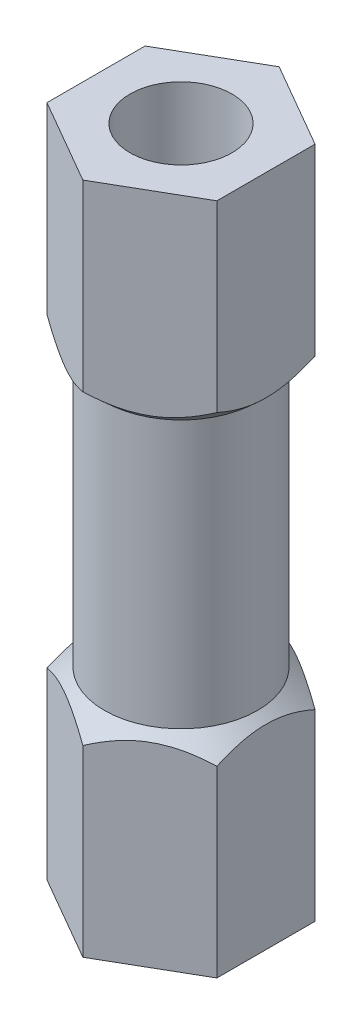
ISO-10303-21;
HEADER;
FILE_DESCRIPTION(('STEP AP214'),'2;1');
FILE_NAME('part.step','',(''),(''),'','','');
FILE_SCHEMA(('AUTOMOTIVE_DESIGN { 1 0 10303 214 1 1 1 1 }'));
ENDSEC;
DATA;
#1=APPLICATION_CONTEXT('core data for automotive mechanical design processes');
#2=APPLICATION_PROTOCOL_DEFINITION('international standard','automotive_design',2000,#1);
#3=PRODUCT_CONTEXT('',#1,'mechanical');
#4=PRODUCT('Part','Part','',(#3));
#5=PRODUCT_RELATED_PRODUCT_CATEGORY('part','',(#4));
#6=PRODUCT_DEFINITION_FORMATION('','',#4);
#7=PRODUCT_DEFINITION_CONTEXT('part definition',#1,'design');
#8=PRODUCT_DEFINITION('design','',#6,#7);
#9=PRODUCT_DEFINITION_SHAPE('','',#8);
#10=(LENGTH_UNIT() NAMED_UNIT(*) SI_UNIT(.MILLI.,.METRE.));
#11=(NAMED_UNIT(*) PLANE_ANGLE_UNIT() SI_UNIT($,.RADIAN.));
#12=(NAMED_UNIT(*) SI_UNIT($,.STERADIAN.) SOLID_ANGLE_UNIT());
#13=UNCERTAINTY_MEASURE_WITH_UNIT(LENGTH_MEASURE(1.E-05),#10,'distance_accuracy_value','');
#14=(GEOMETRIC_REPRESENTATION_CONTEXT(3) GLOBAL_UNCERTAINTY_ASSIGNED_CONTEXT((#13)) GLOBAL_UNIT_ASSIGNED_CONTEXT((#10,
#11,#12)) REPRESENTATION_CONTEXT('',''));
#15=CARTESIAN_POINT('',(0.,0.,0.));
#16=DIRECTION('',(0.,0.,1.));
#17=DIRECTION('',(1.,0.,0.));
#18=AXIS2_PLACEMENT_3D('',#15,#16,#17);
#19=CARTESIAN_POINT('',(-1.541905877699,-13.2460304718258,70.989850960619));
#20=DIRECTION('',(0.,1.,0.));
#21=DIRECTION('',(0.,0.,1.));
#22=AXIS2_PLACEMENT_3D('',#19,#20,#21);
#23=CYLINDRICAL_SURFACE('',#22,1.5);
#24=CARTESIAN_POINT('',(-1.541905877699,-13.2460304718258,70.989850960619));
#25=DIRECTION('',(0.,1.,0.));
#26=DIRECTION('',(0.,0.,1.));
#27=AXIS2_PLACEMENT_3D('',#24,#25,#26);
#28=CIRCLE('',#27,1.5);
#29=CARTESIAN_POINT('',(-0.0419058776989999,-13.2460304718258,70.989850960619));
#30=VERTEX_POINT('',#29);
#31=CARTESIAN_POINT('',(-3.041905877699,-13.2460304718258,70.989850960619));
#32=VERTEX_POINT('',#31);
#33=EDGE_CURVE('E57',#30,#32,#28,.T.);
#34=ORIENTED_EDGE('',*,*,#33,.F.);
#35=CARTESIAN_POINT('',(-1.541905877699,-13.2460304718258,70.989850960619));
#36=DIRECTION('',(0.,1.,0.));
#37=DIRECTION('',(0.,0.,1.));
#38=AXIS2_PLACEMENT_3D('',#35,#36,#37);
#39=CIRCLE('',#38,1.5);
#40=EDGE_CURVE('E519',#32,#30,#39,.T.);
#41=ORIENTED_EDGE('',*,*,#40,.F.);
#42=DIRECTION('',(0.,1.,0.));
#43=VECTOR('',#42,1.);
#44=CARTESIAN_POINT('',(-3.041905877699,-13.2460304718258,70.989850960619));
#45=LINE('',#44,#43);
#46=CARTESIAN_POINT('',(-3.041905877699,6.55396952817417,70.989850960619));
#47=VERTEX_POINT('',#46);
#48=EDGE_CURVE('E11',#32,#47,#45,.T.);
#49=ORIENTED_EDGE('',*,*,#48,.T.);
#50=CARTESIAN_POINT('',(-1.541905877699,6.55396952817417,70.989850960619));
#51=DIRECTION('',(0.,-1.,0.));
#52=DIRECTION('',(0.,0.,-1.));
#53=AXIS2_PLACEMENT_3D('',#50,#51,#52);
#54=CIRCLE('',#53,1.5);
#55=EDGE_CURVE('E353',#47,#47,#54,.T.);
#56=ORIENTED_EDGE('',*,*,#55,.F.);
#57=ORIENTED_EDGE('',*,*,#48,.F.);
#58=EDGE_LOOP('',(#34,#41,#49,#56,#57));
#59=FACE_BOUND('',#58,.T.);
#60=ADVANCED_FACE('F38',(#59),#23,.F.);
#61=CARTESIAN_POINT('',(-1.541905877699,-7.84603047182913,70.989850960619));
#62=DIRECTION('',(0.,-1.,0.));
#63=DIRECTION('',(0.,0.,-1.));
#64=AXIS2_PLACEMENT_3D('',#61,#62,#63);
#65=CONICAL_SURFACE('',#64,2.88000000000367,0.83798122500839);
#66=CARTESIAN_POINT('',(-4.03017079281847,-7.84603047182912,69.5397000332302));
#67=CARTESIAN_POINT('',(-2.791905877699,-7.20715547182333,68.8247874511579));
#68=CARTESIAN_POINT('',(-1.55364096257953,-7.84603047182912,68.1098748690856));
#69=(BOUNDED_CURVE() B_SPLINE_CURVE(2,(#66,#67,#68),.UNSPECIFIED.,.F.,
.F.) B_SPLINE_CURVE_WITH_KNOTS((3,3),(-0.565560291542068,-0.171439030031569),
.UNSPECIFIED.) CURVE() GEOMETRIC_REPRESENTATION_ITEM() RATIONAL_B_SPLINE_CURVE((1.23420074349358,
1.42179925650642,1.23420074349358)) REPRESENTATION_ITEM(''));
#70=CARTESIAN_POINT('',(-4.03017079281208,-7.84603047182583,69.5397000332265));
#71=VERTEX_POINT('',#70);
#72=CARTESIAN_POINT('',(-1.55364096258592,-7.84603047182583,68.1098748690893));
#73=VERTEX_POINT('',#72);
#74=EDGE_CURVE('E336',#71,#73,#69,.T.);
#75=ORIENTED_EDGE('',*,*,#74,.F.);
#76=CARTESIAN_POINT('',(-1.54190587710507,-7.84603047151238,70.9898509609617));
#77=DIRECTION('',(-9.42539925234577E-11,1.,-5.44175679556093E-11));
#78=DIRECTION('',(-1.,-9.42539925234577E-11,0.));
#79=AXIS2_PLACEMENT_3D('',#76,#77,#78);
#80=CIRCLE('',#79,2.88000000068572);
#81=CARTESIAN_POINT('',(-4.041905877699,-7.84603047182583,69.5600257964818));
#82=VERTEX_POINT('',#81);
#83=EDGE_CURVE('E48',#71,#82,#80,.T.);
#84=ORIENTED_EDGE('',*,*,#83,.T.);
#85=CARTESIAN_POINT('',(-4.041905877699,-7.50403047182583,70.989850960619));
#86=CARTESIAN_POINT('',(-4.041905877699,-7.50403047182583,70.3254340627827));
#87=CARTESIAN_POINT('',(-4.04190587769899,-7.84603047182912,69.5600257964744));
#88=(BOUNDED_CURVE() B_SPLINE_CURVE(2,(#85,#86,#87),.UNSPECIFIED.,.F.,
.F.) B_SPLINE_CURVE_WITH_KNOTS((3,3),(-0.368499660786819,-0.171439030031569),
.UNSPECIFIED.) CURVE() GEOMETRIC_REPRESENTATION_ITEM() RATIONAL_B_SPLINE_CURVE((1.328,1.328,1.23420074349358)) REPRESENTATION_ITEM(''));
#89=CARTESIAN_POINT('',(-4.041905877699,-7.50403047182583,70.989850960619));
#90=VERTEX_POINT('',#89);
#91=EDGE_CURVE('E348',#90,#82,#88,.T.);
#92=ORIENTED_EDGE('',*,*,#91,.F.);
#93=DIRECTION('',(0.743294146247167,0.668964731622449,0.));
#94=VECTOR('',#93,1.);
#95=CARTESIAN_POINT('',(-4.106905877699,-7.56253047182583,70.989850960619));
#96=LINE('',#95,#94);
#97=CARTESIAN_POINT('',(-3.791905877699,-7.27903047182583,70.989850960619));
#98=VERTEX_POINT('',#97);
#99=EDGE_CURVE('E400',#90,#98,#96,.T.);
#100=ORIENTED_EDGE('',*,*,#99,.T.);
#101=CARTESIAN_POINT('',(-1.541905877699,-7.27903047182583,70.989850960619));
#102=DIRECTION('',(0.,-1.,0.));
#103=DIRECTION('',(0.,0.,-1.));
#104=AXIS2_PLACEMENT_3D('',#101,#102,#103);
#105=CIRCLE('',#104,2.25);
#106=CARTESIAN_POINT('',(0.708094122301,-7.27903047182583,70.989850960619));
#107=VERTEX_POINT('',#106);
#108=EDGE_CURVE('E406',#98,#107,#105,.T.);
#109=ORIENTED_EDGE('',*,*,#108,.T.);
#110=CARTESIAN_POINT('',(-1.541905877699,-7.27903047182583,70.989850960619));
#111=DIRECTION('',(0.,-1.,0.));
#112=DIRECTION('',(0.,0.,-1.));
#113=AXIS2_PLACEMENT_3D('',#110,#111,#112);
#114=CIRCLE('',#113,2.25);
#115=EDGE_CURVE('E395',#107,#98,#114,.T.);
#116=ORIENTED_EDGE('',*,*,#115,.T.);
#117=ORIENTED_EDGE('',*,*,#99,.F.);
#118=CARTESIAN_POINT('',(-4.041905877699,-7.84603047182912,72.4196761247636));
#119=CARTESIAN_POINT('',(-4.041905877699,-7.50403047182583,71.6542678584552));
#120=CARTESIAN_POINT('',(-4.041905877699,-7.50403047182583,70.989850960619));
#121=(BOUNDED_CURVE() B_SPLINE_CURVE(2,(#118,#119,#120),.UNSPECIFIED.,.F.,
.F.) B_SPLINE_CURVE_WITH_KNOTS((3,3),(-0.565560291542069,-0.368499660786819),
.UNSPECIFIED.) CURVE() GEOMETRIC_REPRESENTATION_ITEM() RATIONAL_B_SPLINE_CURVE((1.23420074349358,
1.328,1.328)) REPRESENTATION_ITEM(''));
#122=CARTESIAN_POINT('',(-4.041905877699,-7.84603047182583,72.4196761247562));
#123=VERTEX_POINT('',#122);
#124=EDGE_CURVE('E354',#123,#90,#121,.T.);
#125=ORIENTED_EDGE('',*,*,#124,.F.);
#126=CARTESIAN_POINT('',(-1.54190587819246,-7.84603047151238,70.989850960905));
#127=DIRECTION('',(-9.4253992482441E-11,1.,5.44175679318921E-11));
#128=DIRECTION('',(-1.,-9.4253992482441E-11,0.));
#129=AXIS2_PLACEMENT_3D('',#126,#127,#128);
#130=CIRCLE('',#129,2.87999999942966);
#131=CARTESIAN_POINT('',(-4.03017079281208,-7.84603047182583,72.4400018880115));
#132=VERTEX_POINT('',#131);
#133=EDGE_CURVE('E386',#123,#132,#130,.T.);
#134=ORIENTED_EDGE('',*,*,#133,.T.);
#135=CARTESIAN_POINT('',(-1.55364096257953,-7.84603047182912,73.8698270521524));
#136=CARTESIAN_POINT('',(-2.791905877699,-7.20715547182333,73.1549144700801));
#137=CARTESIAN_POINT('',(-4.03017079281847,-7.84603047182912,72.4400018880078));
#138=(BOUNDED_CURVE() B_SPLINE_CURVE(2,(#135,#136,#137),.UNSPECIFIED.,.F.,
.F.) B_SPLINE_CURVE_WITH_KNOTS((3,3),(-0.565560291542068,-0.171439030031569),
.UNSPECIFIED.) CURVE() GEOMETRIC_REPRESENTATION_ITEM() RATIONAL_B_SPLINE_CURVE((1.23420074349358,
1.42179925650642,1.23420074349358)) REPRESENTATION_ITEM(''));
#139=CARTESIAN_POINT('',(-1.55364096258592,-7.84603047182583,73.8698270521487));
#140=VERTEX_POINT('',#139);
#141=EDGE_CURVE('E290',#140,#132,#138,.T.);
#142=ORIENTED_EDGE('',*,*,#141,.F.);
#143=CARTESIAN_POINT('',(-1.541905877699,-7.84603047151238,70.9898509602516));
#144=DIRECTION('',(0.,1.,1.08835135899237E-10));
#145=DIRECTION('',(0.,-1.08835135899237E-10,1.));
#146=AXIS2_PLACEMENT_3D('',#143,#144,#145);
#147=CIRCLE('',#146,2.88000000036742);
#148=CARTESIAN_POINT('',(-1.53017079281208,-7.84603047182583,73.8698270521487));
#149=VERTEX_POINT('',#148);
#150=EDGE_CURVE('E377',#140,#149,#147,.T.);
#151=ORIENTED_EDGE('',*,*,#150,.T.);
#152=CARTESIAN_POINT('',(0.946359037420458,-7.84603047182912,72.4400018880078));
#153=CARTESIAN_POINT('',(-0.291905877698998,-7.20715547182335,73.1549144700801));
#154=CARTESIAN_POINT('',(-1.53017079281847,-7.84603047182912,73.8698270521524));
#155=(BOUNDED_CURVE() B_SPLINE_CURVE(2,(#152,#153,#154),.UNSPECIFIED.,.F.,
.F.) B_SPLINE_CURVE_WITH_KNOTS((3,3),(-0.565560291542066,-0.17143903003157),
.UNSPECIFIED.) CURVE() GEOMETRIC_REPRESENTATION_ITEM() RATIONAL_B_SPLINE_CURVE((1.23420074349358,
1.42179925650641,1.23420074349358)) REPRESENTATION_ITEM(''));
#156=CARTESIAN_POINT('',(0.94635903741408,-7.84603047182583,72.4400018880115));
#157=VERTEX_POINT('',#156);
#158=EDGE_CURVE('E300',#157,#149,#155,.T.);
#159=ORIENTED_EDGE('',*,*,#158,.F.);
#160=CARTESIAN_POINT('',(-1.54190587750475,-7.84603047151238,70.9898509607325));
#161=DIRECTION('',(9.42539924935375E-11,1.,5.44175679382882E-11));
#162=DIRECTION('',(-1.,9.42539924935375E-11,0.));
#163=AXIS2_PLACEMENT_3D('',#160,#161,#162);
#164=CIRCLE('',#163,2.87999999977501);
#165=CARTESIAN_POINT('',(0.958094122301,-7.84603047182583,72.4196761247562));
#166=VERTEX_POINT('',#165);
#167=EDGE_CURVE('E368',#157,#166,#164,.T.);
#168=ORIENTED_EDGE('',*,*,#167,.T.);
#169=CARTESIAN_POINT('',(0.958094122301,-7.84603047182912,69.5600257964744));
#170=CARTESIAN_POINT('',(0.958094122301,-7.20715547182335,70.989850960619));
#171=CARTESIAN_POINT('',(0.958094122301,-7.84603047182912,72.4196761247636));
#172=(BOUNDED_CURVE() B_SPLINE_CURVE(2,(#169,#170,#171),.UNSPECIFIED.,.F.,
.F.) B_SPLINE_CURVE_WITH_KNOTS((3,3),(-0.565560291542066,-0.171439030031571),
.UNSPECIFIED.) CURVE() GEOMETRIC_REPRESENTATION_ITEM() RATIONAL_B_SPLINE_CURVE((1.23420074349358,
1.42179925650641,1.23420074349358)) REPRESENTATION_ITEM(''));
#173=CARTESIAN_POINT('',(0.958094122301,-7.84603047182583,69.5600257964818));
#174=VERTEX_POINT('',#173);
#175=EDGE_CURVE('E314',#174,#166,#172,.T.);
#176=ORIENTED_EDGE('',*,*,#175,.F.);
#177=CARTESIAN_POINT('',(-1.54190587831289,-7.84603047151238,70.9898509609736));
#178=DIRECTION('',(9.42539925241471E-11,1.,-5.44175679560201E-11));
#179=DIRECTION('',(-1.,9.42539925241471E-11,0.));
#180=AXIS2_PLACEMENT_3D('',#177,#178,#179);
#181=CIRCLE('',#180,2.88000000070893);
#182=CARTESIAN_POINT('',(0.94635903741408,-7.84603047182583,69.5397000332265));
#183=VERTEX_POINT('',#182);
#184=EDGE_CURVE('E358',#174,#183,#181,.T.);
#185=ORIENTED_EDGE('',*,*,#184,.T.);
#186=CARTESIAN_POINT('',(-1.53017079281846,-7.84603047182912,68.1098748690856));
#187=CARTESIAN_POINT('',(-0.291905877698998,-7.20715547182335,68.8247874511579));
#188=CARTESIAN_POINT('',(0.946359037420471,-7.84603047182912,69.5397000332302));
#189=(BOUNDED_CURVE() B_SPLINE_CURVE(2,(#186,#187,#188),.UNSPECIFIED.,.F.,
.F.) B_SPLINE_CURVE_WITH_KNOTS((3,3),(-0.565560291542066,-0.17143903003157),
.UNSPECIFIED.) CURVE() GEOMETRIC_REPRESENTATION_ITEM() RATIONAL_B_SPLINE_CURVE((1.23420074349358,
1.42179925650641,1.23420074349358)) REPRESENTATION_ITEM(''));
#190=CARTESIAN_POINT('',(-1.53017079281207,-7.84603047182583,68.1098748690893));
#191=VERTEX_POINT('',#190);
#192=EDGE_CURVE('E326',#191,#183,#189,.T.);
#193=ORIENTED_EDGE('',*,*,#192,.F.);
#194=CARTESIAN_POINT('',(-1.54190587769899,-7.84603047151238,70.9898509622402));
#195=DIRECTION('',(0.,1.,-1.08835135946617E-10));
#196=DIRECTION('',(0.,1.08835135946617E-10,1.));
#197=AXIS2_PLACEMENT_3D('',#194,#195,#196);
#198=CIRCLE('',#197,2.88000000162117);
#199=EDGE_CURVE('E355',#191,#73,#198,.T.);
#200=ORIENTED_EDGE('',*,*,#199,.T.);
#201=EDGE_LOOP('',(#75,#84,#92,#100,#109,#116,#117,#125,#134,#142,#151,#159,#168,#176,#185,#193,#200));
#202=FACE_BOUND('',#201,.T.);
#203=ADVANCED_FACE('F537',(#202),#65,.T.);
#204=CARTESIAN_POINT('',(-1.541905877699,-7.84603047182583,70.989850960619));
#205=DIRECTION('',(0.,-1.,0.));
#206=DIRECTION('',(1.,0.,0.));
#207=AXIS2_PLACEMENT_3D('',#204,#205,#206);
#208=PLANE('',#207);
#209=ORIENTED_EDGE('',*,*,#133,.F.);
#210=DIRECTION('',(0.,0.,-1.));
#211=VECTOR('',#210,1.);
#212=CARTESIAN_POINT('',(-4.041905877699,-7.84603047182583,72.4332266335931));
#213=LINE('',#212,#211);
#214=CARTESIAN_POINT('',(-4.041905877699,-7.84603047182583,72.4332266335931));
#215=VERTEX_POINT('',#214);
#216=EDGE_CURVE('E350',#215,#123,#213,.T.);
#217=ORIENTED_EDGE('',*,*,#216,.F.);
#218=DIRECTION('',(-0.866025403784438,0.,-0.5));
#219=VECTOR('',#218,1.);
#220=CARTESIAN_POINT('',(-1.541905877699,-7.84603047182583,73.8766023065671));
#221=LINE('',#220,#219);
#222=EDGE_CURVE('E341',#132,#215,#221,.T.);
#223=ORIENTED_EDGE('',*,*,#222,.F.);
#224=EDGE_LOOP('',(#209,#217,#223));
#225=FACE_BOUND('',#224,.T.);
#226=ADVANCED_FACE('F542',(#225),#208,.F.);
#227=CARTESIAN_POINT('',(-1.541905877699,-7.84603047182583,70.989850960619));
#228=DIRECTION('',(0.,-1.,0.));
#229=DIRECTION('',(1.,0.,0.));
#230=AXIS2_PLACEMENT_3D('',#227,#228,#229);
#231=PLANE('',#230);
#232=ORIENTED_EDGE('',*,*,#150,.F.);
#233=DIRECTION('',(-0.866025403784438,0.,-0.5));
#234=VECTOR('',#233,1.);
#235=CARTESIAN_POINT('',(-1.541905877699,-7.84603047182583,73.8766023065671));
#236=LINE('',#235,#234);
#237=CARTESIAN_POINT('',(-1.541905877699,-7.84603047182583,73.8766023065671));
#238=VERTEX_POINT('',#237);
#239=EDGE_CURVE('E286',#238,#140,#236,.T.);
#240=ORIENTED_EDGE('',*,*,#239,.F.);
#241=DIRECTION('',(-0.866025403784439,0.,0.5));
#242=VECTOR('',#241,1.);
#243=CARTESIAN_POINT('',(0.958094122301,-7.84603047182583,72.4332266335931));
#244=LINE('',#243,#242);
#245=EDGE_CURVE('E297',#149,#238,#244,.T.);
#246=ORIENTED_EDGE('',*,*,#245,.F.);
#247=EDGE_LOOP('',(#232,#240,#246));
#248=FACE_BOUND('',#247,.T.);
#249=ADVANCED_FACE('F548',(#248),#231,.F.);
#250=CARTESIAN_POINT('',(-1.541905877699,-7.84603047182583,70.989850960619));
#251=DIRECTION('',(0.,-1.,0.));
#252=DIRECTION('',(1.,0.,0.));
#253=AXIS2_PLACEMENT_3D('',#250,#251,#252);
#254=PLANE('',#253);
#255=ORIENTED_EDGE('',*,*,#83,.F.);
#256=DIRECTION('',(0.866025403784439,0.,-0.5));
#257=VECTOR('',#256,1.);
#258=CARTESIAN_POINT('',(-4.041905877699,-7.84603047182583,69.5464752876449));
#259=LINE('',#258,#257);
#260=CARTESIAN_POINT('',(-4.041905877699,-7.84603047182583,69.5464752876449));
#261=VERTEX_POINT('',#260);
#262=EDGE_CURVE('E324',#261,#71,#259,.T.);
#263=ORIENTED_EDGE('',*,*,#262,.F.);
#264=DIRECTION('',(0.,0.,-1.));
#265=VECTOR('',#264,1.);
#266=CARTESIAN_POINT('',(-4.041905877699,-7.84603047182583,72.4332266335931));
#267=LINE('',#266,#265);
#268=EDGE_CURVE('E345',#82,#261,#267,.T.);
#269=ORIENTED_EDGE('',*,*,#268,.F.);
#270=EDGE_LOOP('',(#255,#263,#269));
#271=FACE_BOUND('',#270,.T.);
#272=ADVANCED_FACE('F552',(#271),#254,.F.);
#273=CARTESIAN_POINT('',(-1.541905877699,-7.84603047182583,70.989850960619));
#274=DIRECTION('',(0.,-1.,0.));
#275=DIRECTION('',(1.,0.,0.));
#276=AXIS2_PLACEMENT_3D('',#273,#274,#275);
#277=PLANE('',#276);
#278=ORIENTED_EDGE('',*,*,#167,.F.);
#279=DIRECTION('',(-0.866025403784439,0.,0.5));
#280=VECTOR('',#279,1.);
#281=CARTESIAN_POINT('',(0.958094122301,-7.84603047182583,72.4332266335931));
#282=LINE('',#281,#280);
#283=CARTESIAN_POINT('',(0.958094122301,-7.84603047182583,72.4332266335931));
#284=VERTEX_POINT('',#283);
#285=EDGE_CURVE('E301',#284,#157,#282,.T.);
#286=ORIENTED_EDGE('',*,*,#285,.F.);
#287=DIRECTION('',(0.,0.,1.));
#288=VECTOR('',#287,1.);
#289=CARTESIAN_POINT('',(0.958094122301,-7.84603047182583,69.5464752876449));
#290=LINE('',#289,#288);
#291=EDGE_CURVE('E311',#166,#284,#290,.T.);
#292=ORIENTED_EDGE('',*,*,#291,.F.);
#293=EDGE_LOOP('',(#278,#286,#292));
#294=FACE_BOUND('',#293,.T.);
#295=ADVANCED_FACE('F556',(#294),#277,.F.);
#296=CARTESIAN_POINT('',(-1.541905877699,-7.84603047182583,70.989850960619));
#297=DIRECTION('',(0.,-1.,0.));
#298=DIRECTION('',(1.,0.,0.));
#299=AXIS2_PLACEMENT_3D('',#296,#297,#298);
#300=PLANE('',#299);
#301=ORIENTED_EDGE('',*,*,#199,.F.);
#302=DIRECTION('',(0.866025403784439,0.,0.5));
#303=VECTOR('',#302,1.);
#304=CARTESIAN_POINT('',(-1.54190587769899,-7.84603047182583,68.1030996146709));
#305=LINE('',#304,#303);
#306=CARTESIAN_POINT('',(-1.54190587769899,-7.84603047182583,68.1030996146709));
#307=VERTEX_POINT('',#306);
#308=EDGE_CURVE('E312',#307,#191,#305,.T.);
#309=ORIENTED_EDGE('',*,*,#308,.F.);
#310=DIRECTION('',(0.866025403784439,0.,-0.5));
#311=VECTOR('',#310,1.);
#312=CARTESIAN_POINT('',(-4.041905877699,-7.84603047182583,69.5464752876449));
#313=LINE('',#312,#311);
#314=EDGE_CURVE('E334',#73,#307,#313,.T.);
#315=ORIENTED_EDGE('',*,*,#314,.F.);
#316=EDGE_LOOP('',(#301,#309,#315));
#317=FACE_BOUND('',#316,.T.);
#318=ADVANCED_FACE('F560',(#317),#300,.F.);
#319=CARTESIAN_POINT('',(-1.541905877699,-3.34603047182583,70.989850960619));
#320=DIRECTION('',(0.,-1.,0.));
#321=DIRECTION('',(1.,0.,0.));
#322=AXIS2_PLACEMENT_3D('',#319,#320,#321);
#323=CYLINDRICAL_SURFACE('',#322,2.25);
#324=ORIENTED_EDGE('',*,*,#108,.F.);
#325=ORIENTED_EDGE('',*,*,#115,.F.);
#326=DIRECTION('',(0.,1.,0.));
#327=VECTOR('',#326,1.);
#328=CARTESIAN_POINT('',(0.708094122301,-3.34603047182583,70.989850960619));
#329=LINE('',#328,#327);
#330=CARTESIAN_POINT('',(0.708094122301,0.586969528174173,70.989850960619));
#331=VERTEX_POINT('',#330);
#332=EDGE_CURVE('E359',#107,#331,#329,.T.);
#333=ORIENTED_EDGE('',*,*,#332,.T.);
#334=CARTESIAN_POINT('',(-1.541905877699,0.586969528174173,70.989850960619));
#335=DIRECTION('',(0.,1.,0.));
#336=DIRECTION('',(0.,0.,1.));
#337=AXIS2_PLACEMENT_3D('',#334,#335,#336);
#338=CIRCLE('',#337,2.25);
#339=CARTESIAN_POINT('',(-3.791905877699,0.586969528174173,70.989850960619));
#340=VERTEX_POINT('',#339);
#341=EDGE_CURVE('E468',#340,#331,#338,.T.);
#342=ORIENTED_EDGE('',*,*,#341,.F.);
#343=CARTESIAN_POINT('',(-1.541905877699,0.586969528174173,70.989850960619));
#344=DIRECTION('',(0.,1.,0.));
#345=DIRECTION('',(0.,0.,1.));
#346=AXIS2_PLACEMENT_3D('',#343,#344,#345);
#347=CIRCLE('',#346,2.25);
#348=EDGE_CURVE('E466',#331,#340,#347,.T.);
#349=ORIENTED_EDGE('',*,*,#348,.F.);
#350=ORIENTED_EDGE('',*,*,#332,.F.);
#351=EDGE_LOOP('',(#324,#325,#333,#342,#349,#350));
#352=FACE_BOUND('',#351,.T.);
#353=ADVANCED_FACE('F564',(#352),#323,.T.);
#354=CARTESIAN_POINT('',(-1.541905877699,1.15396952817748,70.989850960619));
#355=DIRECTION('',(0.,1.,0.));
#356=DIRECTION('',(0.,0.,1.));
#357=AXIS2_PLACEMENT_3D('',#354,#355,#356);
#358=CONICAL_SURFACE('',#357,2.88000000000367,0.837981225008391);
#359=CARTESIAN_POINT('',(-4.03017079281847,1.15396952817747,72.4400018880078));
#360=CARTESIAN_POINT('',(-2.791905877699,0.515094528171691,73.1549144700801));
#361=CARTESIAN_POINT('',(-1.55364096257953,1.15396952817747,73.8698270521524));
#362=(BOUNDED_CURVE() B_SPLINE_CURVE(2,(#359,#360,#361),.UNSPECIFIED.,.F.,
.F.) B_SPLINE_CURVE_WITH_KNOTS((3,3),(-0.565560291542068,-0.171439030031569),
.UNSPECIFIED.) CURVE() GEOMETRIC_REPRESENTATION_ITEM() RATIONAL_B_SPLINE_CURVE((1.23420074349358,
1.42179925650642,1.23420074349358)) REPRESENTATION_ITEM(''));
#363=CARTESIAN_POINT('',(-4.03017079281208,1.15396952817417,72.4400018880115));
#364=VERTEX_POINT('',#363);
#365=CARTESIAN_POINT('',(-1.55364096258592,1.15396952817417,73.8698270521487));
#366=VERTEX_POINT('',#365);
#367=EDGE_CURVE('E232',#364,#366,#362,.T.);
#368=ORIENTED_EDGE('',*,*,#367,.F.);
#369=CARTESIAN_POINT('',(-1.54190587791684,1.15396952815458,70.9898509607464));
#370=DIRECTION('',(-5.89087453079426E-12,-1.,3.40109799611252E-12));
#371=DIRECTION('',(1.,-5.89087453079426E-12,0.));
#372=AXIS2_PLACEMENT_3D('',#369,#370,#371);
#373=CIRCLE('',#372,2.87999999974765);
#374=CARTESIAN_POINT('',(-4.041905877699,1.15396952817417,72.4196761247562));
#375=VERTEX_POINT('',#374);
#376=EDGE_CURVE('E423',#364,#375,#373,.T.);
#377=ORIENTED_EDGE('',*,*,#376,.T.);
#378=CARTESIAN_POINT('',(-4.041905877699,0.811969528174174,70.989850960619));
#379=CARTESIAN_POINT('',(-4.041905877699,0.811969528174174,71.6542678584552));
#380=CARTESIAN_POINT('',(-4.041905877699,1.15396952817747,72.4196761247636));
#381=(BOUNDED_CURVE() B_SPLINE_CURVE(2,(#378,#379,#380),.UNSPECIFIED.,.F.,
.F.) B_SPLINE_CURVE_WITH_KNOTS((3,3),(-0.368499660786819,-0.171439030031569),
.UNSPECIFIED.) CURVE() GEOMETRIC_REPRESENTATION_ITEM() RATIONAL_B_SPLINE_CURVE((1.328,1.328,1.23420074349358)) REPRESENTATION_ITEM(''));
#382=CARTESIAN_POINT('',(-4.041905877699,0.811969528174174,70.989850960619));
#383=VERTEX_POINT('',#382);
#384=EDGE_CURVE('E488',#383,#375,#381,.T.);
#385=ORIENTED_EDGE('',*,*,#384,.F.);
#386=DIRECTION('',(0.743294146247167,-0.668964731622449,0.));
#387=VECTOR('',#386,1.);
#388=CARTESIAN_POINT('',(-4.106905877699,0.870469528174173,70.989850960619));
#389=LINE('',#388,#387);
#390=EDGE_CURVE('E470',#383,#340,#389,.T.);
#391=ORIENTED_EDGE('',*,*,#390,.T.);
#392=ORIENTED_EDGE('',*,*,#341,.T.);
#393=ORIENTED_EDGE('',*,*,#348,.T.);
#394=ORIENTED_EDGE('',*,*,#390,.F.);
#395=CARTESIAN_POINT('',(-4.04190587769899,1.15396952817747,69.5600257964744));
#396=CARTESIAN_POINT('',(-4.041905877699,0.811969528174174,70.3254340627827));
#397=CARTESIAN_POINT('',(-4.041905877699,0.811969528174174,70.989850960619));
#398=(BOUNDED_CURVE() B_SPLINE_CURVE(2,(#395,#396,#397),.UNSPECIFIED.,.F.,
.F.) B_SPLINE_CURVE_WITH_KNOTS((3,3),(-0.565560291542069,-0.368499660786819),
.UNSPECIFIED.) CURVE() GEOMETRIC_REPRESENTATION_ITEM() RATIONAL_B_SPLINE_CURVE((1.23420074349358,
1.328,1.328)) REPRESENTATION_ITEM(''));
#399=CARTESIAN_POINT('',(-4.041905877699,1.15396952817417,69.5600257964818));
#400=VERTEX_POINT('',#399);
#401=EDGE_CURVE('E492',#400,#383,#398,.T.);
#402=ORIENTED_EDGE('',*,*,#401,.F.);
#403=CARTESIAN_POINT('',(-1.54190587710502,1.15396952815458,70.9898509609617));
#404=DIRECTION('',(-5.8908745327161E-12,-1.,-3.40109799722558E-12));
#405=DIRECTION('',(1.,-5.8908745327161E-12,0.));
#406=AXIS2_PLACEMENT_3D('',#403,#404,#405);
#407=CIRCLE('',#406,2.88000000068577);
#408=CARTESIAN_POINT('',(-4.03017079281208,1.15396952817417,69.5397000332265));
#409=VERTEX_POINT('',#408);
#410=EDGE_CURVE('E457',#400,#409,#407,.T.);
#411=ORIENTED_EDGE('',*,*,#410,.T.);
#412=CARTESIAN_POINT('',(-1.55364096257952,1.15396952817747,68.1098748690856));
#413=CARTESIAN_POINT('',(-2.791905877699,0.515094528171679,68.8247874511579));
#414=CARTESIAN_POINT('',(-4.03017079281847,1.15396952817747,69.5397000332302));
#415=(BOUNDED_CURVE() B_SPLINE_CURVE(2,(#412,#413,#414),.UNSPECIFIED.,.F.,
.F.) B_SPLINE_CURVE_WITH_KNOTS((3,3),(-0.565560291542068,-0.17143903003157),
.UNSPECIFIED.) CURVE() GEOMETRIC_REPRESENTATION_ITEM() RATIONAL_B_SPLINE_CURVE((1.23420074349358,
1.42179925650642,1.23420074349358)) REPRESENTATION_ITEM(''));
#416=CARTESIAN_POINT('',(-1.55364096258592,1.15396952817417,68.1098748690893));
#417=VERTEX_POINT('',#416);
#418=EDGE_CURVE('E278',#417,#409,#415,.T.);
#419=ORIENTED_EDGE('',*,*,#418,.F.);
#420=CARTESIAN_POINT('',(-1.541905877699,1.15396952815458,70.9898509622402));
#421=DIRECTION('',(0.,-1.,-6.80219599666356E-12));
#422=DIRECTION('',(0.,6.80219599666356E-12,-1.));
#423=AXIS2_PLACEMENT_3D('',#420,#421,#422);
#424=CIRCLE('',#423,2.88000000162119);
#425=CARTESIAN_POINT('',(-1.53017079281207,1.15396952817417,68.1098748690893));
#426=VERTEX_POINT('',#425);
#427=EDGE_CURVE('E448',#417,#426,#424,.T.);
#428=ORIENTED_EDGE('',*,*,#427,.T.);
#429=CARTESIAN_POINT('',(0.946359037420471,1.15396952817747,69.5397000332302));
#430=CARTESIAN_POINT('',(-0.291905877699,0.515094528171691,68.8247874511579));
#431=CARTESIAN_POINT('',(-1.53017079281846,1.15396952817747,68.1098748690856));
#432=(BOUNDED_CURVE() B_SPLINE_CURVE(2,(#429,#430,#431),.UNSPECIFIED.,.F.,
.F.) B_SPLINE_CURVE_WITH_KNOTS((3,3),(-0.565560291542066,-0.17143903003157),
.UNSPECIFIED.) CURVE() GEOMETRIC_REPRESENTATION_ITEM() RATIONAL_B_SPLINE_CURVE((1.23420074349358,
1.42179925650642,1.23420074349358)) REPRESENTATION_ITEM(''));
#433=CARTESIAN_POINT('',(0.94635903741408,1.15396952817417,69.5397000332265));
#434=VERTEX_POINT('',#433);
#435=EDGE_CURVE('E269',#434,#426,#432,.T.);
#436=ORIENTED_EDGE('',*,*,#435,.F.);
#437=CARTESIAN_POINT('',(-1.54190587831647,1.15396952815458,70.9898509609756));
#438=DIRECTION('',(5.89087453276794E-12,-1.,-3.40109799725607E-12));
#439=DIRECTION('',(1.,5.89087453276794E-12,0.));
#440=AXIS2_PLACEMENT_3D('',#437,#438,#439);
#441=CIRCLE('',#440,2.88000000071302);
#442=CARTESIAN_POINT('',(0.958094122301,1.15396952817417,69.5600257964818));
#443=VERTEX_POINT('',#442);
#444=EDGE_CURVE('E439',#434,#443,#441,.T.);
#445=ORIENTED_EDGE('',*,*,#444,.T.);
#446=CARTESIAN_POINT('',(0.958094122301,1.15396952817747,72.4196761247636));
#447=CARTESIAN_POINT('',(0.958094122301,0.5150945281717,70.989850960619));
#448=CARTESIAN_POINT('',(0.958094122301012,1.15396952817747,69.5600257964744));
#449=(BOUNDED_CURVE() B_SPLINE_CURVE(2,(#446,#447,#448),.UNSPECIFIED.,.F.,
.F.) B_SPLINE_CURVE_WITH_KNOTS((3,3),(-0.565560291542065,-0.17143903003157),
.UNSPECIFIED.) CURVE() GEOMETRIC_REPRESENTATION_ITEM() RATIONAL_B_SPLINE_CURVE((1.23420074349358,
1.42179925650641,1.23420074349358)) REPRESENTATION_ITEM(''));
#450=CARTESIAN_POINT('',(0.958094122301,1.15396952817417,72.4196761247562));
#451=VERTEX_POINT('',#450);
#452=EDGE_CURVE('E260',#451,#443,#449,.T.);
#453=ORIENTED_EDGE('',*,*,#452,.F.);
#454=CARTESIAN_POINT('',(-1.54190587750111,1.15396952815458,70.9898509607345));
#455=DIRECTION('',(5.89087453083734E-12,-1.,3.4010979961382E-12));
#456=DIRECTION('',(1.,5.89087453083734E-12,0.));
#457=AXIS2_PLACEMENT_3D('',#454,#455,#456);
#458=CIRCLE('',#457,2.87999999977086);
#459=CARTESIAN_POINT('',(0.94635903741408,1.15396952817417,72.4400018880115));
#460=VERTEX_POINT('',#459);
#461=EDGE_CURVE('E429',#451,#460,#458,.T.);
#462=ORIENTED_EDGE('',*,*,#461,.T.);
#463=CARTESIAN_POINT('',(-1.53017079281847,1.15396952817747,73.8698270521524));
#464=CARTESIAN_POINT('',(-0.291905877699,0.515094528171691,73.1549144700801));
#465=CARTESIAN_POINT('',(0.946359037420471,1.15396952817747,72.4400018880078));
#466=(BOUNDED_CURVE() B_SPLINE_CURVE(2,(#463,#464,#465),.UNSPECIFIED.,.F.,
.F.) B_SPLINE_CURVE_WITH_KNOTS((3,3),(-0.565560291542066,-0.17143903003157),
.UNSPECIFIED.) CURVE() GEOMETRIC_REPRESENTATION_ITEM() RATIONAL_B_SPLINE_CURVE((1.23420074349358,
1.42179925650642,1.23420074349358)) REPRESENTATION_ITEM(''));
#467=CARTESIAN_POINT('',(-1.53017079281208,1.15396952817417,73.8698270521487));
#468=VERTEX_POINT('',#467);
#469=EDGE_CURVE('E242',#468,#460,#466,.T.);
#470=ORIENTED_EDGE('',*,*,#469,.F.);
#471=CARTESIAN_POINT('',(-1.541905877699,1.15396952815458,70.9898509602516));
#472=DIRECTION('',(0.,-1.,6.80219599370229E-12));
#473=DIRECTION('',(0.,-6.80219599370229E-12,-1.));
#474=AXIS2_PLACEMENT_3D('',#471,#472,#473);
#475=CIRCLE('',#474,2.88000000036742);
#476=EDGE_CURVE('E239',#468,#366,#475,.T.);
#477=ORIENTED_EDGE('',*,*,#476,.T.);
#478=EDGE_LOOP('',(#368,#377,#385,#391,#392,#393,#394,#402,#411,#419,#428,#436,#445,#453,#462,
#470,#477));
#479=FACE_BOUND('',#478,.T.);
#480=ADVANCED_FACE('F568',(#479),#358,.T.);
#481=CARTESIAN_POINT('',(-1.541905877699,1.15396952817417,70.989850960619));
#482=DIRECTION('',(0.,1.,0.));
#483=DIRECTION('',(0.,0.,1.));
#484=AXIS2_PLACEMENT_3D('',#481,#482,#483);
#485=PLANE('',#484);
#486=ORIENTED_EDGE('',*,*,#410,.F.);
#487=DIRECTION('',(0.,0.,1.));
#488=VECTOR('',#487,1.);
#489=CARTESIAN_POINT('',(-4.041905877699,1.15396952817417,69.5464752876449));
#490=LINE('',#489,#488);
#491=CARTESIAN_POINT('',(-4.041905877699,1.15396952817417,69.5464752876449));
#492=VERTEX_POINT('',#491);
#493=EDGE_CURVE('E430',#492,#400,#490,.T.);
#494=ORIENTED_EDGE('',*,*,#493,.F.);
#495=DIRECTION('',(-0.866025403784439,0.,0.5));
#496=VECTOR('',#495,1.);
#497=CARTESIAN_POINT('',(-1.54190587769899,1.15396952817417,68.1030996146709));
#498=LINE('',#497,#496);
#499=EDGE_CURVE('E279',#409,#492,#498,.T.);
#500=ORIENTED_EDGE('',*,*,#499,.F.);
#501=EDGE_LOOP('',(#486,#494,#500));
#502=FACE_BOUND('',#501,.T.);
#503=ADVANCED_FACE('F572',(#502),#485,.F.);
#504=CARTESIAN_POINT('',(-1.541905877699,1.15396952817417,70.989850960619));
#505=DIRECTION('',(0.,1.,0.));
#506=DIRECTION('',(0.,0.,1.));
#507=AXIS2_PLACEMENT_3D('',#504,#505,#506);
#508=PLANE('',#507);
#509=ORIENTED_EDGE('',*,*,#427,.F.);
#510=DIRECTION('',(-0.866025403784439,0.,0.5));
#511=VECTOR('',#510,1.);
#512=CARTESIAN_POINT('',(-1.54190587769899,1.15396952817417,68.1030996146709));
#513=LINE('',#512,#511);
#514=CARTESIAN_POINT('',(-1.54190587769899,1.15396952817417,68.1030996146709));
#515=VERTEX_POINT('',#514);
#516=EDGE_CURVE('E274',#515,#417,#513,.T.);
#517=ORIENTED_EDGE('',*,*,#516,.F.);
#518=DIRECTION('',(-0.866025403784439,0.,-0.5));
#519=VECTOR('',#518,1.);
#520=CARTESIAN_POINT('',(0.958094122301,1.15396952817417,69.5464752876449));
#521=LINE('',#520,#519);
#522=EDGE_CURVE('E270',#426,#515,#521,.T.);
#523=ORIENTED_EDGE('',*,*,#522,.F.);
#524=EDGE_LOOP('',(#509,#517,#523));
#525=FACE_BOUND('',#524,.T.);
#526=ADVANCED_FACE('F576',(#525),#508,.F.);
#527=CARTESIAN_POINT('',(-1.541905877699,1.15396952817417,70.989850960619));
#528=DIRECTION('',(0.,1.,0.));
#529=DIRECTION('',(0.,0.,1.));
#530=AXIS2_PLACEMENT_3D('',#527,#528,#529);
#531=PLANE('',#530);
#532=ORIENTED_EDGE('',*,*,#376,.F.);
#533=DIRECTION('',(0.866025403784438,0.,0.5));
#534=VECTOR('',#533,1.);
#535=CARTESIAN_POINT('',(-4.041905877699,1.15396952817417,72.4332266335931));
#536=LINE('',#535,#534);
#537=CARTESIAN_POINT('',(-4.041905877699,1.15396952817417,72.4332266335931));
#538=VERTEX_POINT('',#537);
#539=EDGE_CURVE('E42',#538,#364,#536,.T.);
#540=ORIENTED_EDGE('',*,*,#539,.F.);
#541=DIRECTION('',(0.,0.,1.));
#542=VECTOR('',#541,1.);
#543=CARTESIAN_POINT('',(-4.041905877699,1.15396952817417,69.5464752876449));
#544=LINE('',#543,#542);
#545=EDGE_CURVE('E485',#375,#538,#544,.T.);
#546=ORIENTED_EDGE('',*,*,#545,.F.);
#547=EDGE_LOOP('',(#532,#540,#546));
#548=FACE_BOUND('',#547,.T.);
#549=ADVANCED_FACE('F580',(#548),#531,.F.);
#550=CARTESIAN_POINT('',(-1.541905877699,1.15396952817417,70.989850960619));
#551=DIRECTION('',(0.,1.,0.));
#552=DIRECTION('',(0.,0.,1.));
#553=AXIS2_PLACEMENT_3D('',#550,#551,#552);
#554=PLANE('',#553);
#555=ORIENTED_EDGE('',*,*,#444,.F.);
#556=DIRECTION('',(-0.866025403784439,0.,-0.5));
#557=VECTOR('',#556,1.);
#558=CARTESIAN_POINT('',(0.958094122301,1.15396952817417,69.5464752876449));
#559=LINE('',#558,#557);
#560=CARTESIAN_POINT('',(0.958094122301,1.15396952817417,69.5464752876449));
#561=VERTEX_POINT('',#560);
#562=EDGE_CURVE('E265',#561,#434,#559,.T.);
#563=ORIENTED_EDGE('',*,*,#562,.F.);
#564=DIRECTION('',(0.,0.,-1.));
#565=VECTOR('',#564,1.);
#566=CARTESIAN_POINT('',(0.958094122301,1.15396952817417,72.4332266335931));
#567=LINE('',#566,#565);
#568=EDGE_CURVE('E261',#443,#561,#567,.T.);
#569=ORIENTED_EDGE('',*,*,#568,.F.);
#570=EDGE_LOOP('',(#555,#563,#569));
#571=FACE_BOUND('',#570,.T.);
#572=ADVANCED_FACE('F584',(#571),#554,.F.);
#573=CARTESIAN_POINT('',(-1.541905877699,1.15396952817417,70.989850960619));
#574=DIRECTION('',(0.,1.,0.));
#575=DIRECTION('',(0.,0.,1.));
#576=AXIS2_PLACEMENT_3D('',#573,#574,#575);
#577=PLANE('',#576);
#578=ORIENTED_EDGE('',*,*,#476,.F.);
#579=DIRECTION('',(0.866025403784439,0.,-0.5));
#580=VECTOR('',#579,1.);
#581=CARTESIAN_POINT('',(-1.541905877699,1.15396952817417,73.8766023065671));
#582=LINE('',#581,#580);
#583=CARTESIAN_POINT('',(-1.541905877699,1.15396952817417,73.8766023065671));
#584=VERTEX_POINT('',#583);
#585=EDGE_CURVE('E237',#584,#468,#582,.T.);
#586=ORIENTED_EDGE('',*,*,#585,.F.);
#587=DIRECTION('',(0.866025403784438,0.,0.5));
#588=VECTOR('',#587,1.);
#589=CARTESIAN_POINT('',(-4.041905877699,1.15396952817417,72.4332266335931));
#590=LINE('',#589,#588);
#591=EDGE_CURVE('E224',#366,#584,#590,.T.);
#592=ORIENTED_EDGE('',*,*,#591,.F.);
#593=EDGE_LOOP('',(#578,#586,#592));
#594=FACE_BOUND('',#593,.T.);
#595=ADVANCED_FACE('F238',(#594),#577,.F.);
#596=CARTESIAN_POINT('',(-1.541905877699,1.15396952817417,70.989850960619));
#597=DIRECTION('',(0.,1.,0.));
#598=DIRECTION('',(0.,0.,1.));
#599=AXIS2_PLACEMENT_3D('',#596,#597,#598);
#600=PLANE('',#599);
#601=ORIENTED_EDGE('',*,*,#461,.F.);
#602=DIRECTION('',(0.,0.,-1.));
#603=VECTOR('',#602,1.);
#604=CARTESIAN_POINT('',(0.958094122301,1.15396952817417,72.4332266335931));
#605=LINE('',#604,#603);
#606=CARTESIAN_POINT('',(0.958094122301,1.15396952817417,72.4332266335931));
#607=VERTEX_POINT('',#606);
#608=EDGE_CURVE('E256',#607,#451,#605,.T.);
#609=ORIENTED_EDGE('',*,*,#608,.F.);
#610=DIRECTION('',(0.866025403784439,0.,-0.5));
#611=VECTOR('',#610,1.);
#612=CARTESIAN_POINT('',(-1.541905877699,1.15396952817417,73.8766023065671));
#613=LINE('',#612,#611);
#614=EDGE_CURVE('E252',#460,#607,#613,.T.);
#615=ORIENTED_EDGE('',*,*,#614,.F.);
#616=EDGE_LOOP('',(#601,#609,#615));
#617=FACE_BOUND('',#616,.T.);
#618=ADVANCED_FACE('F591',(#617),#600,.F.);
#619=CARTESIAN_POINT('',(-4.041905877699,1.15396952817417,69.5464752876449));
#620=DIRECTION('',(-1.,0.,0.));
#621=DIRECTION('',(0.,-1.,0.));
#622=AXIS2_PLACEMENT_3D('',#619,#620,#621);
#623=PLANE('',#622);
#624=ORIENTED_EDGE('',*,*,#493,.T.);
#625=ORIENTED_EDGE('',*,*,#401,.T.);
#626=ORIENTED_EDGE('',*,*,#384,.T.);
#627=ORIENTED_EDGE('',*,*,#545,.T.);
#628=DIRECTION('',(0.,1.,0.));
#629=VECTOR('',#628,1.);
#630=CARTESIAN_POINT('',(-4.041905877699,1.15396952817417,72.4332266335931));
#631=LINE('',#630,#629);
#632=CARTESIAN_POINT('',(-4.041905877699,6.55396952817417,72.4332266335931));
#633=VERTEX_POINT('',#632);
#634=EDGE_CURVE('E277',#538,#633,#631,.T.);
#635=ORIENTED_EDGE('',*,*,#634,.T.);
#636=DIRECTION('',(0.,0.,1.));
#637=VECTOR('',#636,1.);
#638=CARTESIAN_POINT('',(-4.041905877699,6.55396952817417,69.5464752876449));
#639=LINE('',#638,#637);
#640=CARTESIAN_POINT('',(-4.041905877699,6.55396952817417,69.5464752876449));
#641=VERTEX_POINT('',#640);
#642=EDGE_CURVE('E505',#641,#633,#639,.T.);
#643=ORIENTED_EDGE('',*,*,#642,.F.);
#644=DIRECTION('',(0.,1.,0.));
#645=VECTOR('',#644,1.);
#646=CARTESIAN_POINT('',(-4.041905877699,1.15396952817417,69.5464752876449));
#647=LINE('',#646,#645);
#648=EDGE_CURVE('E268',#492,#641,#647,.T.);
#649=ORIENTED_EDGE('',*,*,#648,.F.);
#650=EDGE_LOOP('',(#624,#625,#626,#627,#635,#643,#649));
#651=FACE_BOUND('',#650,.T.);
#652=ADVANCED_FACE('F594',(#651),#623,.T.);
#653=CARTESIAN_POINT('',(-1.54190587769899,1.15396952817417,68.1030996146709));
#654=DIRECTION('',(-0.5,0.,-0.866025403784439));
#655=DIRECTION('',(0.,-1.,0.));
#656=AXIS2_PLACEMENT_3D('',#653,#654,#655);
#657=PLANE('',#656);
#658=ORIENTED_EDGE('',*,*,#516,.T.);
#659=ORIENTED_EDGE('',*,*,#418,.T.);
#660=ORIENTED_EDGE('',*,*,#499,.T.);
#661=ORIENTED_EDGE('',*,*,#648,.T.);
#662=DIRECTION('',(-0.866025403784439,0.,0.5));
#663=VECTOR('',#662,1.);
#664=CARTESIAN_POINT('',(-1.54190587769899,6.55396952817417,68.1030996146709));
#665=LINE('',#664,#663);
#666=CARTESIAN_POINT('',(-1.54190587769899,6.55396952817417,68.1030996146709));
#667=VERTEX_POINT('',#666);
#668=EDGE_CURVE('E507',#667,#641,#665,.T.);
#669=ORIENTED_EDGE('',*,*,#668,.F.);
#670=DIRECTION('',(0.,1.,0.));
#671=VECTOR('',#670,1.);
#672=CARTESIAN_POINT('',(-1.54190587769899,1.15396952817417,68.1030996146709));
#673=LINE('',#672,#671);
#674=EDGE_CURVE('E259',#515,#667,#673,.T.);
#675=ORIENTED_EDGE('',*,*,#674,.F.);
#676=EDGE_LOOP('',(#658,#659,#660,#661,#669,#675));
#677=FACE_BOUND('',#676,.T.);
#678=ADVANCED_FACE('F598',(#677),#657,.T.);
#679=CARTESIAN_POINT('',(0.958094122301,1.15396952817417,69.5464752876449));
#680=DIRECTION('',(0.5,0.,-0.866025403784439));
#681=DIRECTION('',(0.,1.,0.));
#682=AXIS2_PLACEMENT_3D('',#679,#680,#681);
#683=PLANE('',#682);
#684=ORIENTED_EDGE('',*,*,#562,.T.);
#685=ORIENTED_EDGE('',*,*,#435,.T.);
#686=ORIENTED_EDGE('',*,*,#522,.T.);
#687=ORIENTED_EDGE('',*,*,#674,.T.);
#688=DIRECTION('',(-0.866025403784439,0.,-0.5));
#689=VECTOR('',#688,1.);
#690=CARTESIAN_POINT('',(0.958094122301,6.55396952817417,69.5464752876449));
#691=LINE('',#690,#689);
#692=CARTESIAN_POINT('',(0.958094122301,6.55396952817417,69.5464752876449));
#693=VERTEX_POINT('',#692);
#694=EDGE_CURVE('E510',#693,#667,#691,.T.);
#695=ORIENTED_EDGE('',*,*,#694,.F.);
#696=DIRECTION('',(0.,1.,0.));
#697=VECTOR('',#696,1.);
#698=CARTESIAN_POINT('',(0.958094122301,1.15396952817417,69.5464752876449));
#699=LINE('',#698,#697);
#700=EDGE_CURVE('E241',#561,#693,#699,.T.);
#701=ORIENTED_EDGE('',*,*,#700,.F.);
#702=EDGE_LOOP('',(#684,#685,#686,#687,#695,#701));
#703=FACE_BOUND('',#702,.T.);
#704=ADVANCED_FACE('F602',(#703),#683,.T.);
#705=CARTESIAN_POINT('',(0.958094122301,1.15396952817417,72.4332266335931));
#706=DIRECTION('',(1.,0.,0.));
#707=DIRECTION('',(0.,-1.,0.));
#708=AXIS2_PLACEMENT_3D('',#705,#706,#707);
#709=PLANE('',#708);
#710=ORIENTED_EDGE('',*,*,#608,.T.);
#711=ORIENTED_EDGE('',*,*,#452,.T.);
#712=ORIENTED_EDGE('',*,*,#568,.T.);
#713=ORIENTED_EDGE('',*,*,#700,.T.);
#714=DIRECTION('',(0.,0.,-1.));
#715=VECTOR('',#714,1.);
#716=CARTESIAN_POINT('',(0.958094122301,6.55396952817417,72.4332266335931));
#717=LINE('',#716,#715);
#718=CARTESIAN_POINT('',(0.958094122301,6.55396952817417,72.4332266335931));
#719=VERTEX_POINT('',#718);
#720=EDGE_CURVE('E513',#719,#693,#717,.T.);
#721=ORIENTED_EDGE('',*,*,#720,.F.);
#722=DIRECTION('',(0.,1.,0.));
#723=VECTOR('',#722,1.);
#724=CARTESIAN_POINT('',(0.958094122301,1.15396952817417,72.4332266335931));
#725=LINE('',#724,#723);
#726=EDGE_CURVE('E254',#607,#719,#725,.T.);
#727=ORIENTED_EDGE('',*,*,#726,.F.);
#728=EDGE_LOOP('',(#710,#711,#712,#713,#721,#727));
#729=FACE_BOUND('',#728,.T.);
#730=ADVANCED_FACE('F606',(#729),#709,.T.);
#731=CARTESIAN_POINT('',(-1.541905877699,1.15396952817417,73.8766023065671));
#732=DIRECTION('',(0.5,0.,0.866025403784439));
#733=DIRECTION('',(0.,1.,0.));
#734=AXIS2_PLACEMENT_3D('',#731,#732,#733);
#735=PLANE('',#734);
#736=ORIENTED_EDGE('',*,*,#585,.T.);
#737=ORIENTED_EDGE('',*,*,#469,.T.);
#738=ORIENTED_EDGE('',*,*,#614,.T.);
#739=ORIENTED_EDGE('',*,*,#726,.T.);
#740=DIRECTION('',(0.866025403784439,0.,-0.5));
#741=VECTOR('',#740,1.);
#742=CARTESIAN_POINT('',(-1.541905877699,6.55396952817417,73.8766023065671));
#743=LINE('',#742,#741);
#744=CARTESIAN_POINT('',(-1.541905877699,6.55396952817417,73.8766023065671));
#745=VERTEX_POINT('',#744);
#746=EDGE_CURVE('E247',#745,#719,#743,.T.);
#747=ORIENTED_EDGE('',*,*,#746,.F.);
#748=DIRECTION('',(0.,1.,0.));
#749=VECTOR('',#748,1.);
#750=CARTESIAN_POINT('',(-1.541905877699,1.15396952817417,73.8766023065671));
#751=LINE('',#750,#749);
#752=EDGE_CURVE('E230',#584,#745,#751,.T.);
#753=ORIENTED_EDGE('',*,*,#752,.F.);
#754=EDGE_LOOP('',(#736,#737,#738,#739,#747,#753));
#755=FACE_BOUND('',#754,.T.);
#756=ADVANCED_FACE('F244',(#755),#735,.T.);
#757=CARTESIAN_POINT('',(-4.041905877699,1.15396952817417,72.4332266335931));
#758=DIRECTION('',(-0.5,0.,0.866025403784438));
#759=DIRECTION('',(-0.866025403784438,0.,-0.5));
#760=AXIS2_PLACEMENT_3D('',#757,#758,#759);
#761=PLANE('',#760);
#762=ORIENTED_EDGE('',*,*,#539,.T.);
#763=ORIENTED_EDGE('',*,*,#367,.T.);
#764=ORIENTED_EDGE('',*,*,#591,.T.);
#765=ORIENTED_EDGE('',*,*,#752,.T.);
#766=DIRECTION('',(0.866025403784438,0.,0.5));
#767=VECTOR('',#766,1.);
#768=CARTESIAN_POINT('',(-4.041905877699,6.55396952817417,72.4332266335931));
#769=LINE('',#768,#767);
#770=EDGE_CURVE('E248',#633,#745,#769,.T.);
#771=ORIENTED_EDGE('',*,*,#770,.F.);
#772=ORIENTED_EDGE('',*,*,#634,.F.);
#773=EDGE_LOOP('',(#762,#763,#764,#765,#771,#772));
#774=FACE_BOUND('',#773,.T.);
#775=ADVANCED_FACE('F227',(#774),#761,.T.);
#776=CARTESIAN_POINT('',(-1.54190587769899,6.55396952817417,70.989850960619));
#777=DIRECTION('',(0.,1.,0.));
#778=DIRECTION('',(0.,0.,1.));
#779=AXIS2_PLACEMENT_3D('',#776,#777,#778);
#780=PLANE('',#779);
#781=ORIENTED_EDGE('',*,*,#770,.T.);
#782=ORIENTED_EDGE('',*,*,#746,.T.);
#783=ORIENTED_EDGE('',*,*,#720,.T.);
#784=ORIENTED_EDGE('',*,*,#694,.T.);
#785=ORIENTED_EDGE('',*,*,#668,.T.);
#786=ORIENTED_EDGE('',*,*,#642,.T.);
#787=EDGE_LOOP('',(#781,#782,#783,#784,#785,#786));
#788=FACE_BOUND('',#787,.T.);
#789=ORIENTED_EDGE('',*,*,#55,.T.);
#790=EDGE_LOOP('',(#789));
#791=FACE_BOUND('',#790,.T.);
#792=ADVANCED_FACE('F523',(#788,#791),#780,.T.);
#793=CARTESIAN_POINT('',(-1.541905877699,-7.84603047182583,70.989850960619));
#794=DIRECTION('',(0.,-1.,0.));
#795=DIRECTION('',(1.,0.,0.));
#796=AXIS2_PLACEMENT_3D('',#793,#794,#795);
#797=PLANE('',#796);
#798=ORIENTED_EDGE('',*,*,#184,.F.);
#799=DIRECTION('',(0.,0.,1.));
#800=VECTOR('',#799,1.);
#801=CARTESIAN_POINT('',(0.958094122301,-7.84603047182583,69.5464752876449));
#802=LINE('',#801,#800);
#803=CARTESIAN_POINT('',(0.958094122301,-7.84603047182583,69.5464752876449));
#804=VERTEX_POINT('',#803);
#805=EDGE_CURVE('E298',#804,#174,#802,.T.);
#806=ORIENTED_EDGE('',*,*,#805,.F.);
#807=DIRECTION('',(0.866025403784439,0.,0.5));
#808=VECTOR('',#807,1.);
#809=CARTESIAN_POINT('',(-1.54190587769899,-7.84603047182583,68.1030996146709));
#810=LINE('',#809,#808);
#811=EDGE_CURVE('E323',#183,#804,#810,.T.);
#812=ORIENTED_EDGE('',*,*,#811,.F.);
#813=EDGE_LOOP('',(#798,#806,#812));
#814=FACE_BOUND('',#813,.T.);
#815=ADVANCED_FACE('F525',(#814),#797,.F.);
#816=CARTESIAN_POINT('',(-4.041905877699,-7.84603047182583,72.4332266335931));
#817=DIRECTION('',(-1.,0.,0.));
#818=DIRECTION('',(0.,-1.,0.));
#819=AXIS2_PLACEMENT_3D('',#816,#817,#818);
#820=PLANE('',#819);
#821=ORIENTED_EDGE('',*,*,#216,.T.);
#822=ORIENTED_EDGE('',*,*,#124,.T.);
#823=ORIENTED_EDGE('',*,*,#91,.T.);
#824=ORIENTED_EDGE('',*,*,#268,.T.);
#825=DIRECTION('',(0.,-1.,0.));
#826=VECTOR('',#825,1.);
#827=CARTESIAN_POINT('',(-4.041905877699,-7.84603047182583,69.5464752876449));
#828=LINE('',#827,#826);
#829=CARTESIAN_POINT('',(-4.041905877699,-13.2460304718258,69.5464752876449));
#830=VERTEX_POINT('',#829);
#831=EDGE_CURVE('E289',#261,#830,#828,.T.);
#832=ORIENTED_EDGE('',*,*,#831,.T.);
#833=DIRECTION('',(0.,0.,-1.));
#834=VECTOR('',#833,1.);
#835=CARTESIAN_POINT('',(-4.041905877699,-13.2460304718258,72.4332266335931));
#836=LINE('',#835,#834);
#837=CARTESIAN_POINT('',(-4.041905877699,-13.2460304718258,72.4332266335931));
#838=VERTEX_POINT('',#837);
#839=EDGE_CURVE('E285',#838,#830,#836,.T.);
#840=ORIENTED_EDGE('',*,*,#839,.F.);
#841=DIRECTION('',(0.,-1.,0.));
#842=VECTOR('',#841,1.);
#843=CARTESIAN_POINT('',(-4.041905877699,-7.84603047182583,72.4332266335931));
#844=LINE('',#843,#842);
#845=EDGE_CURVE('E304',#215,#838,#844,.T.);
#846=ORIENTED_EDGE('',*,*,#845,.F.);
#847=EDGE_LOOP('',(#821,#822,#823,#824,#832,#840,#846));
#848=FACE_BOUND('',#847,.T.);
#849=ADVANCED_FACE('F532',(#848),#820,.T.);
#850=CARTESIAN_POINT('',(-1.541905877699,-7.84603047182583,73.8766023065671));
#851=DIRECTION('',(-0.5,0.,0.866025403784438));
#852=DIRECTION('',(-0.866025403784438,0.,-0.5));
#853=AXIS2_PLACEMENT_3D('',#850,#851,#852);
#854=PLANE('',#853);
#855=ORIENTED_EDGE('',*,*,#239,.T.);
#856=ORIENTED_EDGE('',*,*,#141,.T.);
#857=ORIENTED_EDGE('',*,*,#222,.T.);
#858=ORIENTED_EDGE('',*,*,#845,.T.);
#859=DIRECTION('',(-0.866025403784438,0.,-0.5));
#860=VECTOR('',#859,1.);
#861=CARTESIAN_POINT('',(-1.541905877699,-13.2460304718258,73.8766023065671));
#862=LINE('',#861,#860);
#863=CARTESIAN_POINT('',(-1.541905877699,-13.2460304718258,73.8766023065671));
#864=VERTEX_POINT('',#863);
#865=EDGE_CURVE('E281',#864,#838,#862,.T.);
#866=ORIENTED_EDGE('',*,*,#865,.F.);
#867=DIRECTION('',(0.,-1.,0.));
#868=VECTOR('',#867,1.);
#869=CARTESIAN_POINT('',(-1.541905877699,-7.84603047182583,73.8766023065671));
#870=LINE('',#869,#868);
#871=EDGE_CURVE('E294',#238,#864,#870,.T.);
#872=ORIENTED_EDGE('',*,*,#871,.F.);
#873=EDGE_LOOP('',(#855,#856,#857,#858,#866,#872));
#874=FACE_BOUND('',#873,.T.);
#875=ADVANCED_FACE('F642',(#874),#854,.T.);
#876=CARTESIAN_POINT('',(0.958094122301,-7.84603047182583,72.4332266335931));
#877=DIRECTION('',(0.5,0.,0.866025403784439));
#878=DIRECTION('',(0.,1.,0.));
#879=AXIS2_PLACEMENT_3D('',#876,#877,#878);
#880=PLANE('',#879);
#881=ORIENTED_EDGE('',*,*,#285,.T.);
#882=ORIENTED_EDGE('',*,*,#158,.T.);
#883=ORIENTED_EDGE('',*,*,#245,.T.);
#884=ORIENTED_EDGE('',*,*,#871,.T.);
#885=DIRECTION('',(-0.866025403784439,0.,0.5));
#886=VECTOR('',#885,1.);
#887=CARTESIAN_POINT('',(0.958094122301,-13.2460304718258,72.4332266335931));
#888=LINE('',#887,#886);
#889=CARTESIAN_POINT('',(0.958094122301,-13.2460304718258,72.4332266335931));
#890=VERTEX_POINT('',#889);
#891=EDGE_CURVE('E284',#890,#864,#888,.T.);
#892=ORIENTED_EDGE('',*,*,#891,.F.);
#893=DIRECTION('',(0.,-1.,0.));
#894=VECTOR('',#893,1.);
#895=CARTESIAN_POINT('',(0.958094122301,-7.84603047182583,72.4332266335931));
#896=LINE('',#895,#894);
#897=EDGE_CURVE('E308',#284,#890,#896,.T.);
#898=ORIENTED_EDGE('',*,*,#897,.F.);
#899=EDGE_LOOP('',(#881,#882,#883,#884,#892,#898));
#900=FACE_BOUND('',#899,.T.);
#901=ADVANCED_FACE('F653',(#900),#880,.T.);
#902=CARTESIAN_POINT('',(0.958094122301,-7.84603047182583,69.5464752876449));
#903=DIRECTION('',(1.,0.,0.));
#904=DIRECTION('',(0.,-1.,0.));
#905=AXIS2_PLACEMENT_3D('',#902,#903,#904);
#906=PLANE('',#905);
#907=ORIENTED_EDGE('',*,*,#805,.T.);
#908=ORIENTED_EDGE('',*,*,#175,.T.);
#909=ORIENTED_EDGE('',*,*,#291,.T.);
#910=ORIENTED_EDGE('',*,*,#897,.T.);
#911=DIRECTION('',(0.,0.,1.));
#912=VECTOR('',#911,1.);
#913=CARTESIAN_POINT('',(0.958094122301,-13.2460304718258,69.5464752876449));
#914=LINE('',#913,#912);
#915=CARTESIAN_POINT('',(0.958094122301,-13.2460304718258,69.5464752876449));
#916=VERTEX_POINT('',#915);
#917=EDGE_CURVE('E293',#916,#890,#914,.T.);
#918=ORIENTED_EDGE('',*,*,#917,.F.);
#919=DIRECTION('',(0.,-1.,0.));
#920=VECTOR('',#919,1.);
#921=CARTESIAN_POINT('',(0.958094122301,-7.84603047182583,69.5464752876449));
#922=LINE('',#921,#920);
#923=EDGE_CURVE('E320',#804,#916,#922,.T.);
#924=ORIENTED_EDGE('',*,*,#923,.F.);
#925=EDGE_LOOP('',(#907,#908,#909,#910,#918,#924));
#926=FACE_BOUND('',#925,.T.);
#927=ADVANCED_FACE('F665',(#926),#906,.T.);
#928=CARTESIAN_POINT('',(-1.54190587769899,-7.84603047182583,68.1030996146709));
#929=DIRECTION('',(0.5,0.,-0.866025403784439));
#930=DIRECTION('',(0.,1.,0.));
#931=AXIS2_PLACEMENT_3D('',#928,#929,#930);
#932=PLANE('',#931);
#933=ORIENTED_EDGE('',*,*,#308,.T.);
#934=ORIENTED_EDGE('',*,*,#192,.T.);
#935=ORIENTED_EDGE('',*,*,#811,.T.);
#936=ORIENTED_EDGE('',*,*,#923,.T.);
#937=DIRECTION('',(0.866025403784439,0.,0.5));
#938=VECTOR('',#937,1.);
#939=CARTESIAN_POINT('',(-1.54190587769899,-13.2460304718258,68.1030996146709));
#940=LINE('',#939,#938);
#941=CARTESIAN_POINT('',(-1.54190587769899,-13.2460304718258,68.1030996146709));
#942=VERTEX_POINT('',#941);
#943=EDGE_CURVE('E307',#942,#916,#940,.T.);
#944=ORIENTED_EDGE('',*,*,#943,.F.);
#945=DIRECTION('',(0.,-1.,0.));
#946=VECTOR('',#945,1.);
#947=CARTESIAN_POINT('',(-1.54190587769899,-7.84603047182583,68.1030996146709));
#948=LINE('',#947,#946);
#949=EDGE_CURVE('E331',#307,#942,#948,.T.);
#950=ORIENTED_EDGE('',*,*,#949,.F.);
#951=EDGE_LOOP('',(#933,#934,#935,#936,#944,#950));
#952=FACE_BOUND('',#951,.T.);
#953=ADVANCED_FACE('F675',(#952),#932,.T.);
#954=CARTESIAN_POINT('',(-4.041905877699,-7.84603047182583,69.5464752876449));
#955=DIRECTION('',(-0.5,0.,-0.866025403784439));
#956=DIRECTION('',(0.,-1.,0.));
#957=AXIS2_PLACEMENT_3D('',#954,#955,#956);
#958=PLANE('',#957);
#959=ORIENTED_EDGE('',*,*,#262,.T.);
#960=ORIENTED_EDGE('',*,*,#74,.T.);
#961=ORIENTED_EDGE('',*,*,#314,.T.);
#962=ORIENTED_EDGE('',*,*,#949,.T.);
#963=DIRECTION('',(0.866025403784439,0.,-0.5));
#964=VECTOR('',#963,1.);
#965=CARTESIAN_POINT('',(-4.041905877699,-13.2460304718258,69.5464752876449));
#966=LINE('',#965,#964);
#967=EDGE_CURVE('E319',#830,#942,#966,.T.);
#968=ORIENTED_EDGE('',*,*,#967,.F.);
#969=ORIENTED_EDGE('',*,*,#831,.F.);
#970=EDGE_LOOP('',(#959,#960,#961,#962,#968,#969));
#971=FACE_BOUND('',#970,.T.);
#972=ADVANCED_FACE('F685',(#971),#958,.T.);
#973=CARTESIAN_POINT('',(-1.541905877699,-13.2460304718258,70.989850960619));
#974=DIRECTION('',(0.,-1.,0.));
#975=DIRECTION('',(1.,0.,0.));
#976=AXIS2_PLACEMENT_3D('',#973,#974,#975);
#977=PLANE('',#976);
#978=ORIENTED_EDGE('',*,*,#967,.T.);
#979=ORIENTED_EDGE('',*,*,#943,.T.);
#980=ORIENTED_EDGE('',*,*,#917,.T.);
#981=ORIENTED_EDGE('',*,*,#891,.T.);
#982=ORIENTED_EDGE('',*,*,#865,.T.);
#983=ORIENTED_EDGE('',*,*,#839,.T.);
#984=EDGE_LOOP('',(#978,#979,#980,#981,#982,#983));
#985=FACE_BOUND('',#984,.T.);
#986=ORIENTED_EDGE('',*,*,#33,.T.);
#987=ORIENTED_EDGE('',*,*,#40,.T.);
#988=EDGE_LOOP('',(#986,#987));
#989=FACE_BOUND('',#988,.T.);
#990=ADVANCED_FACE('F40',(#985,#989),#977,.T.);
#991=CLOSED_SHELL('',(#60,#203,#226,#249,#272,#295,#318,#353,#480,#503,#526,#549,#572,#595,#618,
#652,#678,#704,#730,#756,#775,#792,#815,#849,#875,#901,#927,#953,#972,#990));
#992=MANIFOLD_SOLID_BREP('B2',#991);
#993=ADVANCED_BREP_SHAPE_REPRESENTATION('',(#18,#992),#14);
#994=SHAPE_DEFINITION_REPRESENTATION(#9,#993);
ENDSEC;
END-ISO-10303-21;
